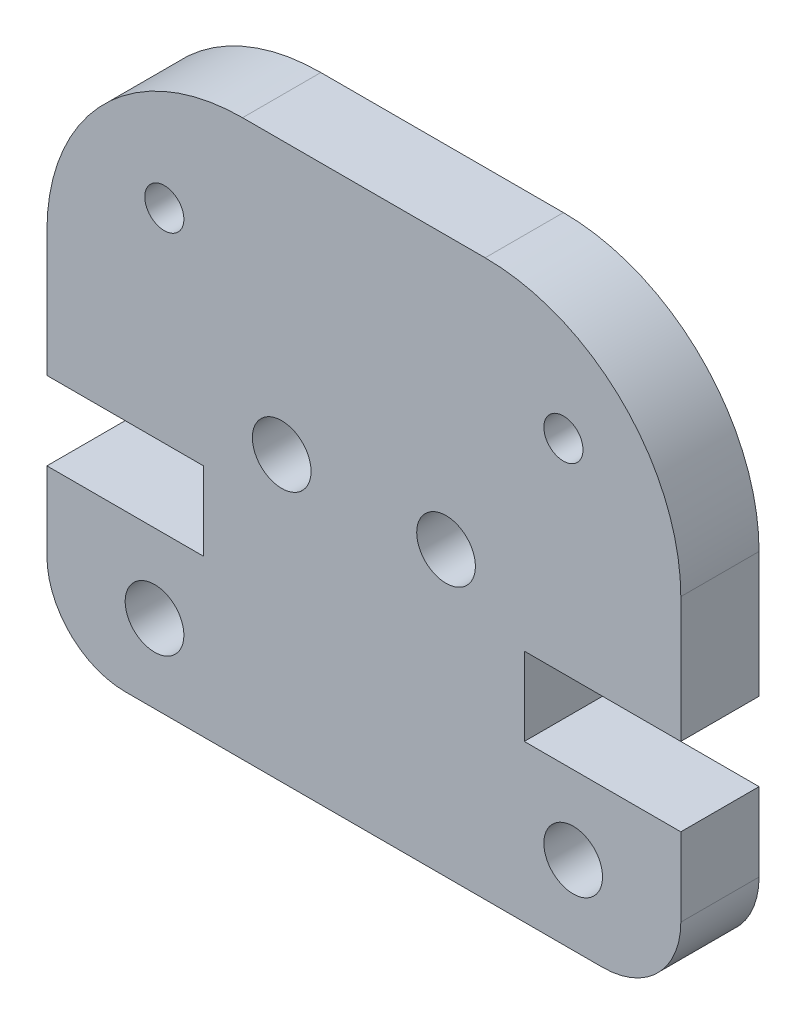
ISO-10303-21;
HEADER;
FILE_DESCRIPTION(('STEP AP214'),'2;1');
FILE_NAME('part.step','',(''),(''),'','','');
FILE_SCHEMA(('AUTOMOTIVE_DESIGN { 1 0 10303 214 1 1 1 1 }'));
ENDSEC;
DATA;
#1=APPLICATION_CONTEXT('core data for automotive mechanical design processes');
#2=APPLICATION_PROTOCOL_DEFINITION('international standard','automotive_design',2000,#1);
#3=PRODUCT_CONTEXT('',#1,'mechanical');
#4=PRODUCT('Part','Part','',(#3));
#5=PRODUCT_RELATED_PRODUCT_CATEGORY('part','',(#4));
#6=PRODUCT_DEFINITION_FORMATION('','',#4);
#7=PRODUCT_DEFINITION_CONTEXT('part definition',#1,'design');
#8=PRODUCT_DEFINITION('design','',#6,#7);
#9=PRODUCT_DEFINITION_SHAPE('','',#8);
#10=(LENGTH_UNIT() NAMED_UNIT(*) SI_UNIT(.MILLI.,.METRE.));
#11=(NAMED_UNIT(*) PLANE_ANGLE_UNIT() SI_UNIT($,.RADIAN.));
#12=(NAMED_UNIT(*) SI_UNIT($,.STERADIAN.) SOLID_ANGLE_UNIT());
#13=UNCERTAINTY_MEASURE_WITH_UNIT(LENGTH_MEASURE(1.E-05),#10,'distance_accuracy_value','');
#14=(GEOMETRIC_REPRESENTATION_CONTEXT(3) GLOBAL_UNCERTAINTY_ASSIGNED_CONTEXT((#13)) GLOBAL_UNIT_ASSIGNED_CONTEXT((#10,
#11,#12)) REPRESENTATION_CONTEXT('',''));
#15=CARTESIAN_POINT('',(0.,0.,0.));
#16=DIRECTION('',(0.,0.,1.));
#17=DIRECTION('',(1.,0.,0.));
#18=AXIS2_PLACEMENT_3D('',#15,#16,#17);
#19=CARTESIAN_POINT('',(14.2,2.00000000000002,2.));
#20=DIRECTION('',(0.,0.,-1.));
#21=DIRECTION('',(-1.,0.,0.));
#22=AXIS2_PLACEMENT_3D('',#19,#20,#21);
#23=PLANE('',#22);
#24=CARTESIAN_POINT('',(3.00000000000434,11.2049999999999,2.));
#25=DIRECTION('',(0.,0.,1.));
#26=DIRECTION('',(1.,0.,0.));
#27=AXIS2_PLACEMENT_3D('',#24,#25,#26);
#28=CIRCLE('',#27,0.499999999999944);
#29=CARTESIAN_POINT('',(3.50000000000429,11.2049999999999,2.));
#30=VERTEX_POINT('',#29);
#31=EDGE_CURVE('E352',#30,#30,#28,.T.);
#32=ORIENTED_EDGE('',*,*,#31,.F.);
#33=EDGE_LOOP('',(#32));
#34=FACE_BOUND('',#33,.T.);
#35=CARTESIAN_POINT('',(10.2000000000053,7.25000000000003,2.));
#36=DIRECTION('',(0.,0.,1.));
#37=DIRECTION('',(-1.,0.,0.));
#38=AXIS2_PLACEMENT_3D('',#35,#36,#37);
#39=CIRCLE('',#38,0.75);
#40=CARTESIAN_POINT('',(9.45000000000532,7.25000000000003,2.));
#41=VERTEX_POINT('',#40);
#42=EDGE_CURVE('E364',#41,#41,#39,.T.);
#43=ORIENTED_EDGE('',*,*,#42,.F.);
#44=EDGE_LOOP('',(#43));
#45=FACE_BOUND('',#44,.T.);
#46=CARTESIAN_POINT('',(13.45,2.00000000000002,2.));
#47=DIRECTION('',(0.,0.,1.));
#48=DIRECTION('',(-1.,0.,0.));
#49=AXIS2_PLACEMENT_3D('',#46,#47,#48);
#50=CIRCLE('',#49,0.750000000000004);
#51=CARTESIAN_POINT('',(12.7,2.00000000000002,2.));
#52=VERTEX_POINT('',#51);
#53=EDGE_CURVE('E182',#52,#52,#50,.T.);
#54=ORIENTED_EDGE('',*,*,#53,.F.);
#55=EDGE_LOOP('',(#54));
#56=FACE_BOUND('',#55,.T.);
#57=CARTESIAN_POINT('',(14.2,2.00000000000002,2.));
#58=DIRECTION('',(0.,0.,1.));
#59=DIRECTION('',(-1.,0.,0.));
#60=AXIS2_PLACEMENT_3D('',#57,#58,#59);
#61=CIRCLE('',#60,2.00000000000001);
#62=CARTESIAN_POINT('',(14.2,0.,2.));
#63=VERTEX_POINT('',#62);
#64=CARTESIAN_POINT('',(16.2,2.00000000000002,2.));
#65=VERTEX_POINT('',#64);
#66=EDGE_CURVE('E209',#63,#65,#61,.T.);
#67=ORIENTED_EDGE('',*,*,#66,.T.);
#68=DIRECTION('',(0.,1.,0.));
#69=VECTOR('',#68,1.);
#70=CARTESIAN_POINT('',(16.2,2.00000000000002,2.));
#71=LINE('',#70,#69);
#72=CARTESIAN_POINT('',(16.2,4.00000000000002,2.));
#73=VERTEX_POINT('',#72);
#74=EDGE_CURVE('E117',#65,#73,#71,.T.);
#75=ORIENTED_EDGE('',*,*,#74,.T.);
#76=DIRECTION('',(-1.,0.,0.));
#77=VECTOR('',#76,1.);
#78=CARTESIAN_POINT('',(12.2,4.00000000000002,2.));
#79=LINE('',#78,#77);
#80=CARTESIAN_POINT('',(12.2,4.00000000000002,2.));
#81=VERTEX_POINT('',#80);
#82=EDGE_CURVE('E248',#73,#81,#79,.T.);
#83=ORIENTED_EDGE('',*,*,#82,.T.);
#84=DIRECTION('',(0.,1.,0.));
#85=VECTOR('',#84,1.);
#86=CARTESIAN_POINT('',(12.2,6.00000000000003,2.));
#87=LINE('',#86,#85);
#88=CARTESIAN_POINT('',(12.2,6.00000000000003,2.));
#89=VERTEX_POINT('',#88);
#90=EDGE_CURVE('E267',#81,#89,#87,.T.);
#91=ORIENTED_EDGE('',*,*,#90,.T.);
#92=DIRECTION('',(1.,0.,0.));
#93=VECTOR('',#92,1.);
#94=CARTESIAN_POINT('',(16.2,6.00000000000003,2.));
#95=LINE('',#94,#93);
#96=CARTESIAN_POINT('',(16.2,6.00000000000003,2.));
#97=VERTEX_POINT('',#96);
#98=EDGE_CURVE('E264',#89,#97,#95,.T.);
#99=ORIENTED_EDGE('',*,*,#98,.T.);
#100=DIRECTION('',(0.,1.,0.));
#101=VECTOR('',#100,1.);
#102=CARTESIAN_POINT('',(16.2,9.205,2.));
#103=LINE('',#102,#101);
#104=CARTESIAN_POINT('',(16.2,9.205,2.));
#105=VERTEX_POINT('',#104);
#106=EDGE_CURVE('E266',#97,#105,#103,.T.);
#107=ORIENTED_EDGE('',*,*,#106,.T.);
#108=CARTESIAN_POINT('',(11.2,9.20499999999999,2.));
#109=DIRECTION('',(0.,0.,1.));
#110=DIRECTION('',(-1.,0.,0.));
#111=AXIS2_PLACEMENT_3D('',#108,#109,#110);
#112=CIRCLE('',#111,5.);
#113=CARTESIAN_POINT('',(11.2,14.205,2.));
#114=VERTEX_POINT('',#113);
#115=EDGE_CURVE('E269',#105,#114,#112,.T.);
#116=ORIENTED_EDGE('',*,*,#115,.T.);
#117=DIRECTION('',(-1.,0.,0.));
#118=VECTOR('',#117,1.);
#119=CARTESIAN_POINT('',(5.,14.205,2.));
#120=LINE('',#119,#118);
#121=CARTESIAN_POINT('',(5.,14.205,2.));
#122=VERTEX_POINT('',#121);
#123=EDGE_CURVE('E275',#114,#122,#120,.T.);
#124=ORIENTED_EDGE('',*,*,#123,.T.);
#125=CARTESIAN_POINT('',(5.,9.20499999999999,2.));
#126=DIRECTION('',(0.,0.,1.));
#127=DIRECTION('',(1.,0.,0.));
#128=AXIS2_PLACEMENT_3D('',#125,#126,#127);
#129=CIRCLE('',#128,5.);
#130=CARTESIAN_POINT('',(0.,9.20499999999999,2.));
#131=VERTEX_POINT('',#130);
#132=EDGE_CURVE('E277',#122,#131,#129,.T.);
#133=ORIENTED_EDGE('',*,*,#132,.T.);
#134=DIRECTION('',(0.,-1.,0.));
#135=VECTOR('',#134,1.);
#136=CARTESIAN_POINT('',(0.,9.20499999999999,2.));
#137=LINE('',#136,#135);
#138=CARTESIAN_POINT('',(0.,6.00000000000003,2.));
#139=VERTEX_POINT('',#138);
#140=EDGE_CURVE('E279',#131,#139,#137,.T.);
#141=ORIENTED_EDGE('',*,*,#140,.T.);
#142=DIRECTION('',(1.,0.,0.));
#143=VECTOR('',#142,1.);
#144=CARTESIAN_POINT('',(0.,6.00000000000003,2.));
#145=LINE('',#144,#143);
#146=CARTESIAN_POINT('',(4.00000000000001,6.00000000000003,2.));
#147=VERTEX_POINT('',#146);
#148=EDGE_CURVE('E281',#139,#147,#145,.T.);
#149=ORIENTED_EDGE('',*,*,#148,.T.);
#150=DIRECTION('',(0.,-1.,0.));
#151=VECTOR('',#150,1.);
#152=CARTESIAN_POINT('',(4.00000000000001,6.00000000000003,2.));
#153=LINE('',#152,#151);
#154=CARTESIAN_POINT('',(4.00000000000001,4.00000000000002,2.));
#155=VERTEX_POINT('',#154);
#156=EDGE_CURVE('E283',#147,#155,#153,.T.);
#157=ORIENTED_EDGE('',*,*,#156,.T.);
#158=DIRECTION('',(-1.,0.,0.));
#159=VECTOR('',#158,1.);
#160=CARTESIAN_POINT('',(4.00000000000001,4.00000000000002,2.));
#161=LINE('',#160,#159);
#162=CARTESIAN_POINT('',(0.,4.00000000000003,2.));
#163=VERTEX_POINT('',#162);
#164=EDGE_CURVE('E160',#155,#163,#161,.T.);
#165=ORIENTED_EDGE('',*,*,#164,.T.);
#166=DIRECTION('',(0.,-1.,0.));
#167=VECTOR('',#166,1.);
#168=CARTESIAN_POINT('',(0.,2.00000000000001,2.));
#169=LINE('',#168,#167);
#170=CARTESIAN_POINT('',(0.,2.00000000000001,2.));
#171=VERTEX_POINT('',#170);
#172=EDGE_CURVE('E154',#163,#171,#169,.T.);
#173=ORIENTED_EDGE('',*,*,#172,.T.);
#174=CARTESIAN_POINT('',(2.,2.00000000000001,2.));
#175=DIRECTION('',(0.,0.,1.));
#176=DIRECTION('',(1.,0.,0.));
#177=AXIS2_PLACEMENT_3D('',#174,#175,#176);
#178=CIRCLE('',#177,2.00000000000001);
#179=CARTESIAN_POINT('',(2.,0.,2.));
#180=VERTEX_POINT('',#179);
#181=EDGE_CURVE('E158',#171,#180,#178,.T.);
#182=ORIENTED_EDGE('',*,*,#181,.T.);
#183=DIRECTION('',(1.,0.,0.));
#184=VECTOR('',#183,1.);
#185=CARTESIAN_POINT('',(2.,0.,2.));
#186=LINE('',#185,#184);
#187=EDGE_CURVE('E50',#180,#63,#186,.T.);
#188=ORIENTED_EDGE('',*,*,#187,.T.);
#189=EDGE_LOOP('',(#67,#75,#83,#91,#99,#107,#116,#124,#133,#141,#149,#157,#165,#173,#182,#188));
#190=FACE_BOUND('',#189,.T.);
#191=CARTESIAN_POINT('',(13.1999999999957,11.2049999999999,2.));
#192=DIRECTION('',(0.,0.,1.));
#193=DIRECTION('',(-1.,0.,0.));
#194=AXIS2_PLACEMENT_3D('',#191,#192,#193);
#195=CIRCLE('',#194,0.499999999999945);
#196=CARTESIAN_POINT('',(12.6999999999957,11.2049999999999,2.));
#197=VERTEX_POINT('',#196);
#198=EDGE_CURVE('E370',#197,#197,#195,.T.);
#199=ORIENTED_EDGE('',*,*,#198,.F.);
#200=EDGE_LOOP('',(#199));
#201=FACE_BOUND('',#200,.T.);
#202=CARTESIAN_POINT('',(5.99999999999468,7.25000000000003,2.));
#203=DIRECTION('',(0.,0.,1.));
#204=DIRECTION('',(1.,0.,0.));
#205=AXIS2_PLACEMENT_3D('',#202,#203,#204);
#206=CIRCLE('',#205,0.75);
#207=CARTESIAN_POINT('',(6.74999999999468,7.25000000000003,2.));
#208=VERTEX_POINT('',#207);
#209=EDGE_CURVE('E358',#208,#208,#206,.T.);
#210=ORIENTED_EDGE('',*,*,#209,.F.);
#211=EDGE_LOOP('',(#210));
#212=FACE_BOUND('',#211,.T.);
#213=CARTESIAN_POINT('',(2.75,2.00000000000018,2.));
#214=DIRECTION('',(0.,0.,1.));
#215=DIRECTION('',(1.,0.,0.));
#216=AXIS2_PLACEMENT_3D('',#213,#214,#215);
#217=CIRCLE('',#216,0.750000000000887);
#218=CARTESIAN_POINT('',(3.50000000000089,2.00000000000018,2.));
#219=VERTEX_POINT('',#218);
#220=EDGE_CURVE('E343',#219,#219,#217,.T.);
#221=ORIENTED_EDGE('',*,*,#220,.F.);
#222=EDGE_LOOP('',(#221));
#223=FACE_BOUND('',#222,.T.);
#224=ADVANCED_FACE('F33',(#34,#45,#56,#190,#201,#212,#223),#23,.F.);
#225=CARTESIAN_POINT('',(14.2,2.00000000000002,0.));
#226=DIRECTION('',(0.,0.,-1.));
#227=DIRECTION('',(-1.,0.,0.));
#228=AXIS2_PLACEMENT_3D('',#225,#226,#227);
#229=PLANE('',#228);
#230=CARTESIAN_POINT('',(3.00000000000434,11.2049999999999,0.));
#231=DIRECTION('',(0.,0.,1.));
#232=DIRECTION('',(1.,0.,0.));
#233=AXIS2_PLACEMENT_3D('',#230,#231,#232);
#234=CIRCLE('',#233,0.499999999999944);
#235=CARTESIAN_POINT('',(3.50000000000429,11.2049999999999,0.));
#236=VERTEX_POINT('',#235);
#237=EDGE_CURVE('E349',#236,#236,#234,.T.);
#238=ORIENTED_EDGE('',*,*,#237,.T.);
#239=EDGE_LOOP('',(#238));
#240=FACE_BOUND('',#239,.T.);
#241=CARTESIAN_POINT('',(10.2000000000053,7.25000000000003,0.));
#242=DIRECTION('',(0.,0.,1.));
#243=DIRECTION('',(-1.,0.,0.));
#244=AXIS2_PLACEMENT_3D('',#241,#242,#243);
#245=CIRCLE('',#244,0.75);
#246=CARTESIAN_POINT('',(9.45000000000532,7.25000000000003,0.));
#247=VERTEX_POINT('',#246);
#248=EDGE_CURVE('E361',#247,#247,#245,.T.);
#249=ORIENTED_EDGE('',*,*,#248,.T.);
#250=EDGE_LOOP('',(#249));
#251=FACE_BOUND('',#250,.T.);
#252=CARTESIAN_POINT('',(13.45,2.00000000000002,0.));
#253=DIRECTION('',(0.,0.,1.));
#254=DIRECTION('',(-1.,0.,0.));
#255=AXIS2_PLACEMENT_3D('',#252,#253,#254);
#256=CIRCLE('',#255,0.750000000000004);
#257=CARTESIAN_POINT('',(12.7,2.00000000000002,0.));
#258=VERTEX_POINT('',#257);
#259=EDGE_CURVE('E373',#258,#258,#256,.T.);
#260=ORIENTED_EDGE('',*,*,#259,.T.);
#261=EDGE_LOOP('',(#260));
#262=FACE_BOUND('',#261,.T.);
#263=CARTESIAN_POINT('',(14.2,2.00000000000002,0.));
#264=DIRECTION('',(0.,0.,1.));
#265=DIRECTION('',(-1.,0.,0.));
#266=AXIS2_PLACEMENT_3D('',#263,#264,#265);
#267=CIRCLE('',#266,2.00000000000001);
#268=CARTESIAN_POINT('',(14.2,0.,0.));
#269=VERTEX_POINT('',#268);
#270=CARTESIAN_POINT('',(16.2,2.00000000000002,0.));
#271=VERTEX_POINT('',#270);
#272=EDGE_CURVE('E178',#269,#271,#267,.T.);
#273=ORIENTED_EDGE('',*,*,#272,.F.);
#274=DIRECTION('',(1.,0.,0.));
#275=VECTOR('',#274,1.);
#276=CARTESIAN_POINT('',(2.,0.,0.));
#277=LINE('',#276,#275);
#278=CARTESIAN_POINT('',(2.,0.,0.));
#279=VERTEX_POINT('',#278);
#280=EDGE_CURVE('E109',#279,#269,#277,.T.);
#281=ORIENTED_EDGE('',*,*,#280,.F.);
#282=CARTESIAN_POINT('',(2.,2.00000000000001,0.));
#283=DIRECTION('',(0.,0.,1.));
#284=DIRECTION('',(1.,0.,0.));
#285=AXIS2_PLACEMENT_3D('',#282,#283,#284);
#286=CIRCLE('',#285,2.00000000000001);
#287=CARTESIAN_POINT('',(0.,2.00000000000001,0.));
#288=VERTEX_POINT('',#287);
#289=EDGE_CURVE('E103',#288,#279,#286,.T.);
#290=ORIENTED_EDGE('',*,*,#289,.F.);
#291=DIRECTION('',(0.,-1.,0.));
#292=VECTOR('',#291,1.);
#293=CARTESIAN_POINT('',(0.,2.00000000000001,0.));
#294=LINE('',#293,#292);
#295=CARTESIAN_POINT('',(0.,4.00000000000003,0.));
#296=VERTEX_POINT('',#295);
#297=EDGE_CURVE('E168',#296,#288,#294,.T.);
#298=ORIENTED_EDGE('',*,*,#297,.F.);
#299=DIRECTION('',(-1.,0.,0.));
#300=VECTOR('',#299,1.);
#301=CARTESIAN_POINT('',(4.00000000000001,4.00000000000002,0.));
#302=LINE('',#301,#300);
#303=CARTESIAN_POINT('',(4.00000000000001,4.00000000000002,0.));
#304=VERTEX_POINT('',#303);
#305=EDGE_CURVE('E204',#304,#296,#302,.T.);
#306=ORIENTED_EDGE('',*,*,#305,.F.);
#307=DIRECTION('',(0.,-1.,0.));
#308=VECTOR('',#307,1.);
#309=CARTESIAN_POINT('',(4.00000000000001,6.00000000000003,0.));
#310=LINE('',#309,#308);
#311=CARTESIAN_POINT('',(4.00000000000001,6.00000000000003,0.));
#312=VERTEX_POINT('',#311);
#313=EDGE_CURVE('E202',#312,#304,#310,.T.);
#314=ORIENTED_EDGE('',*,*,#313,.F.);
#315=DIRECTION('',(1.,0.,0.));
#316=VECTOR('',#315,1.);
#317=CARTESIAN_POINT('',(0.,6.00000000000003,0.));
#318=LINE('',#317,#316);
#319=CARTESIAN_POINT('',(0.,6.00000000000003,0.));
#320=VERTEX_POINT('',#319);
#321=EDGE_CURVE('E200',#320,#312,#318,.T.);
#322=ORIENTED_EDGE('',*,*,#321,.F.);
#323=DIRECTION('',(0.,-1.,0.));
#324=VECTOR('',#323,1.);
#325=CARTESIAN_POINT('',(0.,9.20499999999999,0.));
#326=LINE('',#325,#324);
#327=CARTESIAN_POINT('',(0.,9.20499999999999,0.));
#328=VERTEX_POINT('',#327);
#329=EDGE_CURVE('E198',#328,#320,#326,.T.);
#330=ORIENTED_EDGE('',*,*,#329,.F.);
#331=CARTESIAN_POINT('',(5.,9.20499999999999,0.));
#332=DIRECTION('',(0.,0.,1.));
#333=DIRECTION('',(1.,0.,0.));
#334=AXIS2_PLACEMENT_3D('',#331,#332,#333);
#335=CIRCLE('',#334,5.);
#336=CARTESIAN_POINT('',(5.,14.205,0.));
#337=VERTEX_POINT('',#336);
#338=EDGE_CURVE('E196',#337,#328,#335,.T.);
#339=ORIENTED_EDGE('',*,*,#338,.F.);
#340=DIRECTION('',(-1.,0.,0.));
#341=VECTOR('',#340,1.);
#342=CARTESIAN_POINT('',(5.,14.205,0.));
#343=LINE('',#342,#341);
#344=CARTESIAN_POINT('',(11.2,14.205,0.));
#345=VERTEX_POINT('',#344);
#346=EDGE_CURVE('E194',#345,#337,#343,.T.);
#347=ORIENTED_EDGE('',*,*,#346,.F.);
#348=CARTESIAN_POINT('',(11.2,9.20499999999999,0.));
#349=DIRECTION('',(0.,0.,1.));
#350=DIRECTION('',(-1.,0.,0.));
#351=AXIS2_PLACEMENT_3D('',#348,#349,#350);
#352=CIRCLE('',#351,5.);
#353=CARTESIAN_POINT('',(16.2,9.205,0.));
#354=VERTEX_POINT('',#353);
#355=EDGE_CURVE('E192',#354,#345,#352,.T.);
#356=ORIENTED_EDGE('',*,*,#355,.F.);
#357=DIRECTION('',(0.,1.,0.));
#358=VECTOR('',#357,1.);
#359=CARTESIAN_POINT('',(16.2,9.205,0.));
#360=LINE('',#359,#358);
#361=CARTESIAN_POINT('',(16.2,6.00000000000003,0.));
#362=VERTEX_POINT('',#361);
#363=EDGE_CURVE('E190',#362,#354,#360,.T.);
#364=ORIENTED_EDGE('',*,*,#363,.F.);
#365=DIRECTION('',(1.,0.,0.));
#366=VECTOR('',#365,1.);
#367=CARTESIAN_POINT('',(16.2,6.00000000000003,0.));
#368=LINE('',#367,#366);
#369=CARTESIAN_POINT('',(12.2,6.00000000000003,0.));
#370=VERTEX_POINT('',#369);
#371=EDGE_CURVE('E188',#370,#362,#368,.T.);
#372=ORIENTED_EDGE('',*,*,#371,.F.);
#373=DIRECTION('',(0.,1.,0.));
#374=VECTOR('',#373,1.);
#375=CARTESIAN_POINT('',(12.2,6.00000000000003,0.));
#376=LINE('',#375,#374);
#377=CARTESIAN_POINT('',(12.2,4.00000000000002,0.));
#378=VERTEX_POINT('',#377);
#379=EDGE_CURVE('E186',#378,#370,#376,.T.);
#380=ORIENTED_EDGE('',*,*,#379,.F.);
#381=DIRECTION('',(-1.,0.,0.));
#382=VECTOR('',#381,1.);
#383=CARTESIAN_POINT('',(12.2,4.00000000000002,0.));
#384=LINE('',#383,#382);
#385=CARTESIAN_POINT('',(16.2,4.00000000000002,0.));
#386=VERTEX_POINT('',#385);
#387=EDGE_CURVE('E184',#386,#378,#384,.T.);
#388=ORIENTED_EDGE('',*,*,#387,.F.);
#389=DIRECTION('',(0.,1.,0.));
#390=VECTOR('',#389,1.);
#391=CARTESIAN_POINT('',(16.2,2.00000000000002,0.));
#392=LINE('',#391,#390);
#393=EDGE_CURVE('E181',#271,#386,#392,.T.);
#394=ORIENTED_EDGE('',*,*,#393,.F.);
#395=EDGE_LOOP('',(#273,#281,#290,#298,#306,#314,#322,#330,#339,#347,#356,#364,#372,#380,#388,#394));
#396=FACE_BOUND('',#395,.T.);
#397=CARTESIAN_POINT('',(13.1999999999957,11.2049999999999,0.));
#398=DIRECTION('',(0.,0.,1.));
#399=DIRECTION('',(-1.,0.,0.));
#400=AXIS2_PLACEMENT_3D('',#397,#398,#399);
#401=CIRCLE('',#400,0.499999999999945);
#402=CARTESIAN_POINT('',(12.6999999999957,11.2049999999999,0.));
#403=VERTEX_POINT('',#402);
#404=EDGE_CURVE('E367',#403,#403,#401,.T.);
#405=ORIENTED_EDGE('',*,*,#404,.T.);
#406=EDGE_LOOP('',(#405));
#407=FACE_BOUND('',#406,.T.);
#408=CARTESIAN_POINT('',(5.99999999999468,7.25000000000003,0.));
#409=DIRECTION('',(0.,0.,1.));
#410=DIRECTION('',(1.,0.,0.));
#411=AXIS2_PLACEMENT_3D('',#408,#409,#410);
#412=CIRCLE('',#411,0.75);
#413=CARTESIAN_POINT('',(6.74999999999468,7.25000000000003,0.));
#414=VERTEX_POINT('',#413);
#415=EDGE_CURVE('E355',#414,#414,#412,.T.);
#416=ORIENTED_EDGE('',*,*,#415,.T.);
#417=EDGE_LOOP('',(#416));
#418=FACE_BOUND('',#417,.T.);
#419=CARTESIAN_POINT('',(2.75,2.00000000000018,0.));
#420=DIRECTION('',(0.,0.,1.));
#421=DIRECTION('',(1.,0.,0.));
#422=AXIS2_PLACEMENT_3D('',#419,#420,#421);
#423=CIRCLE('',#422,0.750000000000887);
#424=CARTESIAN_POINT('',(3.50000000000089,2.00000000000018,0.));
#425=VERTEX_POINT('',#424);
#426=EDGE_CURVE('E346',#425,#425,#423,.T.);
#427=ORIENTED_EDGE('',*,*,#426,.T.);
#428=EDGE_LOOP('',(#427));
#429=FACE_BOUND('',#428,.T.);
#430=ADVANCED_FACE('F252',(#240,#251,#262,#396,#407,#418,#429),#229,.T.);
#431=CARTESIAN_POINT('',(14.2,2.00000000000002,2.));
#432=DIRECTION('',(0.,0.,-1.));
#433=DIRECTION('',(-1.,0.,0.));
#434=AXIS2_PLACEMENT_3D('',#431,#432,#433);
#435=CYLINDRICAL_SURFACE('',#434,2.00000000000001);
#436=ORIENTED_EDGE('',*,*,#272,.T.);
#437=DIRECTION('',(0.,0.,-1.));
#438=VECTOR('',#437,1.);
#439=CARTESIAN_POINT('',(16.2,2.00000000000002,2.));
#440=LINE('',#439,#438);
#441=EDGE_CURVE('E11',#65,#271,#440,.T.);
#442=ORIENTED_EDGE('',*,*,#441,.F.);
#443=ORIENTED_EDGE('',*,*,#66,.F.);
#444=DIRECTION('',(0.,0.,-1.));
#445=VECTOR('',#444,1.);
#446=CARTESIAN_POINT('',(14.2,0.,2.));
#447=LINE('',#446,#445);
#448=EDGE_CURVE('E174',#63,#269,#447,.T.);
#449=ORIENTED_EDGE('',*,*,#448,.T.);
#450=EDGE_LOOP('',(#436,#442,#443,#449));
#451=FACE_BOUND('',#450,.T.);
#452=ADVANCED_FACE('F35',(#451),#435,.T.);
#453=CARTESIAN_POINT('',(16.2,2.00000000000002,2.));
#454=DIRECTION('',(-1.,0.,0.));
#455=DIRECTION('',(0.,0.,1.));
#456=AXIS2_PLACEMENT_3D('',#453,#454,#455);
#457=PLANE('',#456);
#458=ORIENTED_EDGE('',*,*,#393,.T.);
#459=DIRECTION('',(0.,0.,-1.));
#460=VECTOR('',#459,1.);
#461=CARTESIAN_POINT('',(16.2,4.00000000000002,2.));
#462=LINE('',#461,#460);
#463=EDGE_CURVE('E42',#73,#386,#462,.T.);
#464=ORIENTED_EDGE('',*,*,#463,.F.);
#465=ORIENTED_EDGE('',*,*,#74,.F.);
#466=ORIENTED_EDGE('',*,*,#441,.T.);
#467=EDGE_LOOP('',(#458,#464,#465,#466));
#468=FACE_BOUND('',#467,.T.);
#469=ADVANCED_FACE('F540',(#468),#457,.F.);
#470=CARTESIAN_POINT('',(12.2,4.00000000000002,2.));
#471=DIRECTION('',(0.,-1.,0.));
#472=DIRECTION('',(1.,0.,0.));
#473=AXIS2_PLACEMENT_3D('',#470,#471,#472);
#474=PLANE('',#473);
#475=ORIENTED_EDGE('',*,*,#387,.T.);
#476=DIRECTION('',(0.,0.,-1.));
#477=VECTOR('',#476,1.);
#478=CARTESIAN_POINT('',(12.2,4.00000000000002,2.));
#479=LINE('',#478,#477);
#480=EDGE_CURVE('E240',#81,#378,#479,.T.);
#481=ORIENTED_EDGE('',*,*,#480,.F.);
#482=ORIENTED_EDGE('',*,*,#82,.F.);
#483=ORIENTED_EDGE('',*,*,#463,.T.);
#484=EDGE_LOOP('',(#475,#481,#482,#483));
#485=FACE_BOUND('',#484,.T.);
#486=ADVANCED_FACE('F246',(#485),#474,.F.);
#487=CARTESIAN_POINT('',(12.2,6.00000000000003,2.));
#488=DIRECTION('',(-1.,0.,0.));
#489=DIRECTION('',(0.,-1.,0.));
#490=AXIS2_PLACEMENT_3D('',#487,#488,#489);
#491=PLANE('',#490);
#492=ORIENTED_EDGE('',*,*,#379,.T.);
#493=DIRECTION('',(0.,0.,-1.));
#494=VECTOR('',#493,1.);
#495=CARTESIAN_POINT('',(12.2,6.00000000000003,2.));
#496=LINE('',#495,#494);
#497=EDGE_CURVE('E237',#89,#370,#496,.T.);
#498=ORIENTED_EDGE('',*,*,#497,.F.);
#499=ORIENTED_EDGE('',*,*,#90,.F.);
#500=ORIENTED_EDGE('',*,*,#480,.T.);
#501=EDGE_LOOP('',(#492,#498,#499,#500));
#502=FACE_BOUND('',#501,.T.);
#503=ADVANCED_FACE('F258',(#502),#491,.F.);
#504=CARTESIAN_POINT('',(16.2,6.00000000000003,2.));
#505=DIRECTION('',(0.,1.,0.));
#506=DIRECTION('',(-1.,0.,0.));
#507=AXIS2_PLACEMENT_3D('',#504,#505,#506);
#508=PLANE('',#507);
#509=ORIENTED_EDGE('',*,*,#371,.T.);
#510=DIRECTION('',(0.,0.,-1.));
#511=VECTOR('',#510,1.);
#512=CARTESIAN_POINT('',(16.2,6.00000000000003,2.));
#513=LINE('',#512,#511);
#514=EDGE_CURVE('E234',#97,#362,#513,.T.);
#515=ORIENTED_EDGE('',*,*,#514,.F.);
#516=ORIENTED_EDGE('',*,*,#98,.F.);
#517=ORIENTED_EDGE('',*,*,#497,.T.);
#518=EDGE_LOOP('',(#509,#515,#516,#517));
#519=FACE_BOUND('',#518,.T.);
#520=ADVANCED_FACE('F262',(#519),#508,.F.);
#521=CARTESIAN_POINT('',(16.2,9.205,2.));
#522=DIRECTION('',(-1.,0.,0.));
#523=DIRECTION('',(0.,-1.,0.));
#524=AXIS2_PLACEMENT_3D('',#521,#522,#523);
#525=PLANE('',#524);
#526=ORIENTED_EDGE('',*,*,#363,.T.);
#527=DIRECTION('',(0.,0.,-1.));
#528=VECTOR('',#527,1.);
#529=CARTESIAN_POINT('',(16.2,9.205,2.));
#530=LINE('',#529,#528);
#531=EDGE_CURVE('E231',#105,#354,#530,.T.);
#532=ORIENTED_EDGE('',*,*,#531,.F.);
#533=ORIENTED_EDGE('',*,*,#106,.F.);
#534=ORIENTED_EDGE('',*,*,#514,.T.);
#535=EDGE_LOOP('',(#526,#532,#533,#534));
#536=FACE_BOUND('',#535,.T.);
#537=ADVANCED_FACE('F505',(#536),#525,.F.);
#538=CARTESIAN_POINT('',(11.2,9.20499999999999,2.));
#539=DIRECTION('',(0.,0.,-1.));
#540=DIRECTION('',(-1.,0.,0.));
#541=AXIS2_PLACEMENT_3D('',#538,#539,#540);
#542=CYLINDRICAL_SURFACE('',#541,5.);
#543=ORIENTED_EDGE('',*,*,#355,.T.);
#544=DIRECTION('',(0.,0.,-1.));
#545=VECTOR('',#544,1.);
#546=CARTESIAN_POINT('',(11.2,14.205,2.));
#547=LINE('',#546,#545);
#548=EDGE_CURVE('E228',#114,#345,#547,.T.);
#549=ORIENTED_EDGE('',*,*,#548,.F.);
#550=ORIENTED_EDGE('',*,*,#115,.F.);
#551=ORIENTED_EDGE('',*,*,#531,.T.);
#552=EDGE_LOOP('',(#543,#549,#550,#551));
#553=FACE_BOUND('',#552,.T.);
#554=ADVANCED_FACE('F495',(#553),#542,.T.);
#555=CARTESIAN_POINT('',(5.,14.205,2.));
#556=DIRECTION('',(0.,-1.,0.));
#557=DIRECTION('',(0.,0.,-1.));
#558=AXIS2_PLACEMENT_3D('',#555,#556,#557);
#559=PLANE('',#558);
#560=ORIENTED_EDGE('',*,*,#346,.T.);
#561=DIRECTION('',(0.,0.,-1.));
#562=VECTOR('',#561,1.);
#563=CARTESIAN_POINT('',(5.,14.205,2.));
#564=LINE('',#563,#562);
#565=EDGE_CURVE('E225',#122,#337,#564,.T.);
#566=ORIENTED_EDGE('',*,*,#565,.F.);
#567=ORIENTED_EDGE('',*,*,#123,.F.);
#568=ORIENTED_EDGE('',*,*,#548,.T.);
#569=EDGE_LOOP('',(#560,#566,#567,#568));
#570=FACE_BOUND('',#569,.T.);
#571=ADVANCED_FACE('F485',(#570),#559,.F.);
#572=CARTESIAN_POINT('',(5.,9.20499999999999,2.));
#573=DIRECTION('',(0.,0.,-1.));
#574=DIRECTION('',(-1.,0.,0.));
#575=AXIS2_PLACEMENT_3D('',#572,#573,#574);
#576=CYLINDRICAL_SURFACE('',#575,5.);
#577=ORIENTED_EDGE('',*,*,#338,.T.);
#578=DIRECTION('',(0.,0.,-1.));
#579=VECTOR('',#578,1.);
#580=CARTESIAN_POINT('',(0.,9.20499999999999,2.));
#581=LINE('',#580,#579);
#582=EDGE_CURVE('E222',#131,#328,#581,.T.);
#583=ORIENTED_EDGE('',*,*,#582,.F.);
#584=ORIENTED_EDGE('',*,*,#132,.F.);
#585=ORIENTED_EDGE('',*,*,#565,.T.);
#586=EDGE_LOOP('',(#577,#583,#584,#585));
#587=FACE_BOUND('',#586,.T.);
#588=ADVANCED_FACE('F475',(#587),#576,.T.);
#589=CARTESIAN_POINT('',(0.,9.20499999999999,2.));
#590=DIRECTION('',(1.,0.,0.));
#591=DIRECTION('',(0.,0.,-1.));
#592=AXIS2_PLACEMENT_3D('',#589,#590,#591);
#593=PLANE('',#592);
#594=ORIENTED_EDGE('',*,*,#329,.T.);
#595=DIRECTION('',(0.,0.,-1.));
#596=VECTOR('',#595,1.);
#597=CARTESIAN_POINT('',(0.,6.00000000000003,2.));
#598=LINE('',#597,#596);
#599=EDGE_CURVE('E219',#139,#320,#598,.T.);
#600=ORIENTED_EDGE('',*,*,#599,.F.);
#601=ORIENTED_EDGE('',*,*,#140,.F.);
#602=ORIENTED_EDGE('',*,*,#582,.T.);
#603=EDGE_LOOP('',(#594,#600,#601,#602));
#604=FACE_BOUND('',#603,.T.);
#605=ADVANCED_FACE('F465',(#604),#593,.F.);
#606=CARTESIAN_POINT('',(0.,6.00000000000003,2.));
#607=DIRECTION('',(0.,1.,0.));
#608=DIRECTION('',(-1.,0.,0.));
#609=AXIS2_PLACEMENT_3D('',#606,#607,#608);
#610=PLANE('',#609);
#611=ORIENTED_EDGE('',*,*,#321,.T.);
#612=DIRECTION('',(0.,0.,-1.));
#613=VECTOR('',#612,1.);
#614=CARTESIAN_POINT('',(4.00000000000001,6.00000000000003,2.));
#615=LINE('',#614,#613);
#616=EDGE_CURVE('E216',#147,#312,#615,.T.);
#617=ORIENTED_EDGE('',*,*,#616,.F.);
#618=ORIENTED_EDGE('',*,*,#148,.F.);
#619=ORIENTED_EDGE('',*,*,#599,.T.);
#620=EDGE_LOOP('',(#611,#617,#618,#619));
#621=FACE_BOUND('',#620,.T.);
#622=ADVANCED_FACE('F456',(#621),#610,.F.);
#623=CARTESIAN_POINT('',(4.00000000000001,6.00000000000003,2.));
#624=DIRECTION('',(1.,0.,0.));
#625=DIRECTION('',(0.,0.,-1.));
#626=AXIS2_PLACEMENT_3D('',#623,#624,#625);
#627=PLANE('',#626);
#628=ORIENTED_EDGE('',*,*,#313,.T.);
#629=DIRECTION('',(0.,0.,-1.));
#630=VECTOR('',#629,1.);
#631=CARTESIAN_POINT('',(4.00000000000001,4.00000000000002,2.));
#632=LINE('',#631,#630);
#633=EDGE_CURVE('E213',#155,#304,#632,.T.);
#634=ORIENTED_EDGE('',*,*,#633,.F.);
#635=ORIENTED_EDGE('',*,*,#156,.F.);
#636=ORIENTED_EDGE('',*,*,#616,.T.);
#637=EDGE_LOOP('',(#628,#634,#635,#636));
#638=FACE_BOUND('',#637,.T.);
#639=ADVANCED_FACE('F289',(#638),#627,.F.);
#640=CARTESIAN_POINT('',(4.00000000000001,4.00000000000002,2.));
#641=DIRECTION('',(0.,-1.,0.));
#642=DIRECTION('',(1.,0.,0.));
#643=AXIS2_PLACEMENT_3D('',#640,#641,#642);
#644=PLANE('',#643);
#645=ORIENTED_EDGE('',*,*,#305,.T.);
#646=DIRECTION('',(0.,0.,-1.));
#647=VECTOR('',#646,1.);
#648=CARTESIAN_POINT('',(0.,4.00000000000003,2.));
#649=LINE('',#648,#647);
#650=EDGE_CURVE('E169',#163,#296,#649,.T.);
#651=ORIENTED_EDGE('',*,*,#650,.F.);
#652=ORIENTED_EDGE('',*,*,#164,.F.);
#653=ORIENTED_EDGE('',*,*,#633,.T.);
#654=EDGE_LOOP('',(#645,#651,#652,#653));
#655=FACE_BOUND('',#654,.T.);
#656=ADVANCED_FACE('F293',(#655),#644,.F.);
#657=CARTESIAN_POINT('',(0.,2.00000000000001,2.));
#658=DIRECTION('',(1.,0.,0.));
#659=DIRECTION('',(0.,0.,-1.));
#660=AXIS2_PLACEMENT_3D('',#657,#658,#659);
#661=PLANE('',#660);
#662=ORIENTED_EDGE('',*,*,#297,.T.);
#663=DIRECTION('',(0.,0.,-1.));
#664=VECTOR('',#663,1.);
#665=CARTESIAN_POINT('',(0.,2.00000000000001,2.));
#666=LINE('',#665,#664);
#667=EDGE_CURVE('E165',#171,#288,#666,.T.);
#668=ORIENTED_EDGE('',*,*,#667,.F.);
#669=ORIENTED_EDGE('',*,*,#172,.F.);
#670=ORIENTED_EDGE('',*,*,#650,.T.);
#671=EDGE_LOOP('',(#662,#668,#669,#670));
#672=FACE_BOUND('',#671,.T.);
#673=ADVANCED_FACE('F166',(#672),#661,.F.);
#674=CARTESIAN_POINT('',(2.,2.00000000000001,2.));
#675=DIRECTION('',(0.,0.,-1.));
#676=DIRECTION('',(-1.,0.,0.));
#677=AXIS2_PLACEMENT_3D('',#674,#675,#676);
#678=CYLINDRICAL_SURFACE('',#677,2.00000000000001);
#679=ORIENTED_EDGE('',*,*,#289,.T.);
#680=DIRECTION('',(0.,0.,-1.));
#681=VECTOR('',#680,1.);
#682=CARTESIAN_POINT('',(2.,0.,2.));
#683=LINE('',#682,#681);
#684=EDGE_CURVE('E170',#180,#279,#683,.T.);
#685=ORIENTED_EDGE('',*,*,#684,.F.);
#686=ORIENTED_EDGE('',*,*,#181,.F.);
#687=ORIENTED_EDGE('',*,*,#667,.T.);
#688=EDGE_LOOP('',(#679,#685,#686,#687));
#689=FACE_BOUND('',#688,.T.);
#690=ADVANCED_FACE('F172',(#689),#678,.T.);
#691=CARTESIAN_POINT('',(2.,0.,2.));
#692=DIRECTION('',(0.,1.,0.));
#693=DIRECTION('',(-1.,0.,0.));
#694=AXIS2_PLACEMENT_3D('',#691,#692,#693);
#695=PLANE('',#694);
#696=ORIENTED_EDGE('',*,*,#280,.T.);
#697=ORIENTED_EDGE('',*,*,#448,.F.);
#698=ORIENTED_EDGE('',*,*,#187,.F.);
#699=ORIENTED_EDGE('',*,*,#684,.T.);
#700=EDGE_LOOP('',(#696,#697,#698,#699));
#701=FACE_BOUND('',#700,.T.);
#702=ADVANCED_FACE('F297',(#701),#695,.F.);
#703=CARTESIAN_POINT('',(13.45,2.00000000000002,2.));
#704=DIRECTION('',(0.,0.,-1.));
#705=DIRECTION('',(-1.,0.,0.));
#706=AXIS2_PLACEMENT_3D('',#703,#704,#705);
#707=CYLINDRICAL_SURFACE('',#706,0.750000000000004);
#708=ORIENTED_EDGE('',*,*,#53,.T.);
#709=EDGE_LOOP('',(#708));
#710=FACE_BOUND('',#709,.T.);
#711=ORIENTED_EDGE('',*,*,#259,.F.);
#712=EDGE_LOOP('',(#711));
#713=FACE_BOUND('',#712,.T.);
#714=ADVANCED_FACE('F299',(#710,#713),#707,.F.);
#715=CARTESIAN_POINT('',(13.1999999999957,11.2049999999999,2.));
#716=DIRECTION('',(0.,0.,-1.));
#717=DIRECTION('',(-1.,0.,0.));
#718=AXIS2_PLACEMENT_3D('',#715,#716,#717);
#719=CYLINDRICAL_SURFACE('',#718,0.499999999999945);
#720=ORIENTED_EDGE('',*,*,#198,.T.);
#721=EDGE_LOOP('',(#720));
#722=FACE_BOUND('',#721,.T.);
#723=ORIENTED_EDGE('',*,*,#404,.F.);
#724=EDGE_LOOP('',(#723));
#725=FACE_BOUND('',#724,.T.);
#726=ADVANCED_FACE('F305',(#722,#725),#719,.F.);
#727=CARTESIAN_POINT('',(10.2000000000053,7.25000000000003,2.));
#728=DIRECTION('',(0.,0.,-1.));
#729=DIRECTION('',(-1.,0.,0.));
#730=AXIS2_PLACEMENT_3D('',#727,#728,#729);
#731=CYLINDRICAL_SURFACE('',#730,0.75);
#732=ORIENTED_EDGE('',*,*,#42,.T.);
#733=EDGE_LOOP('',(#732));
#734=FACE_BOUND('',#733,.T.);
#735=ORIENTED_EDGE('',*,*,#248,.F.);
#736=EDGE_LOOP('',(#735));
#737=FACE_BOUND('',#736,.T.);
#738=ADVANCED_FACE('F322',(#734,#737),#731,.F.);
#739=CARTESIAN_POINT('',(5.99999999999468,7.25000000000003,2.));
#740=DIRECTION('',(0.,0.,-1.));
#741=DIRECTION('',(-1.,0.,0.));
#742=AXIS2_PLACEMENT_3D('',#739,#740,#741);
#743=CYLINDRICAL_SURFACE('',#742,0.75);
#744=ORIENTED_EDGE('',*,*,#209,.T.);
#745=EDGE_LOOP('',(#744));
#746=FACE_BOUND('',#745,.T.);
#747=ORIENTED_EDGE('',*,*,#415,.F.);
#748=EDGE_LOOP('',(#747));
#749=FACE_BOUND('',#748,.T.);
#750=ADVANCED_FACE('F326',(#746,#749),#743,.F.);
#751=CARTESIAN_POINT('',(3.00000000000434,11.2049999999999,2.));
#752=DIRECTION('',(0.,0.,-1.));
#753=DIRECTION('',(-1.,0.,0.));
#754=AXIS2_PLACEMENT_3D('',#751,#752,#753);
#755=CYLINDRICAL_SURFACE('',#754,0.499999999999944);
#756=ORIENTED_EDGE('',*,*,#31,.T.);
#757=EDGE_LOOP('',(#756));
#758=FACE_BOUND('',#757,.T.);
#759=ORIENTED_EDGE('',*,*,#237,.F.);
#760=EDGE_LOOP('',(#759));
#761=FACE_BOUND('',#760,.T.);
#762=ADVANCED_FACE('F330',(#758,#761),#755,.F.);
#763=CARTESIAN_POINT('',(2.75,2.00000000000018,2.));
#764=DIRECTION('',(0.,0.,-1.));
#765=DIRECTION('',(-1.,0.,0.));
#766=AXIS2_PLACEMENT_3D('',#763,#764,#765);
#767=CYLINDRICAL_SURFACE('',#766,0.750000000000887);
#768=ORIENTED_EDGE('',*,*,#220,.T.);
#769=EDGE_LOOP('',(#768));
#770=FACE_BOUND('',#769,.T.);
#771=ORIENTED_EDGE('',*,*,#426,.F.);
#772=EDGE_LOOP('',(#771));
#773=FACE_BOUND('',#772,.T.);
#774=ADVANCED_FACE('F334',(#770,#773),#767,.F.);
#775=CLOSED_SHELL('',(#224,#430,#452,#469,#486,#503,#520,#537,#554,#571,#588,#605,#622,#639,
#656,#673,#690,#702,#714,#726,#738,#750,#762,#774));
#776=MANIFOLD_SOLID_BREP('B2',#775);
#777=ADVANCED_BREP_SHAPE_REPRESENTATION('',(#18,#776),#14);
#778=SHAPE_DEFINITION_REPRESENTATION(#9,#777);
ENDSEC;
END-ISO-10303-21;
